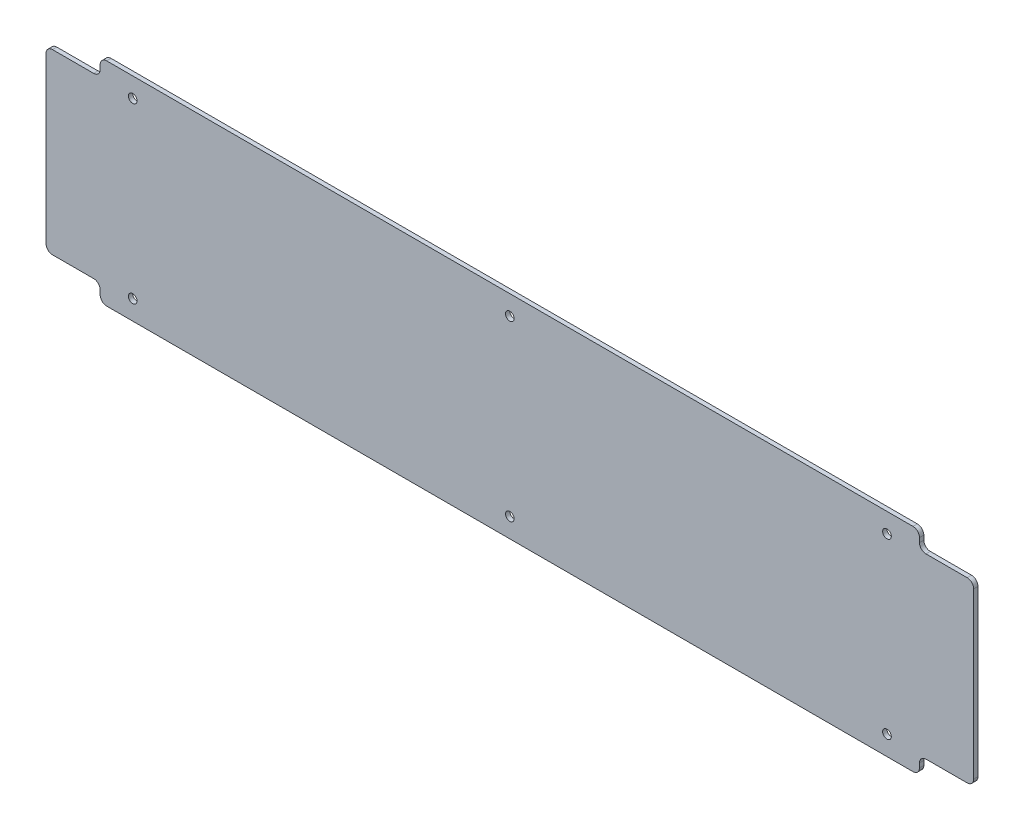
ISO-10303-21;
HEADER;
FILE_DESCRIPTION(('STEP AP214'),'2;1');
FILE_NAME('part.step','',(''),(''),'','','');
FILE_SCHEMA(('AUTOMOTIVE_DESIGN { 1 0 10303 214 1 1 1 1 }'));
ENDSEC;
DATA;
#1=APPLICATION_CONTEXT('core data for automotive mechanical design processes');
#2=APPLICATION_PROTOCOL_DEFINITION('international standard','automotive_design',2000,#1);
#3=PRODUCT_CONTEXT('',#1,'mechanical');
#4=PRODUCT('Part','Part','',(#3));
#5=PRODUCT_RELATED_PRODUCT_CATEGORY('part','',(#4));
#6=PRODUCT_DEFINITION_FORMATION('','',#4);
#7=PRODUCT_DEFINITION_CONTEXT('part definition',#1,'design');
#8=PRODUCT_DEFINITION('design','',#6,#7);
#9=PRODUCT_DEFINITION_SHAPE('','',#8);
#10=(LENGTH_UNIT() NAMED_UNIT(*) SI_UNIT(.MILLI.,.METRE.));
#11=(NAMED_UNIT(*) PLANE_ANGLE_UNIT() SI_UNIT($,.RADIAN.));
#12=(NAMED_UNIT(*) SI_UNIT($,.STERADIAN.) SOLID_ANGLE_UNIT());
#13=UNCERTAINTY_MEASURE_WITH_UNIT(LENGTH_MEASURE(1.E-05),#10,'distance_accuracy_value','');
#14=(GEOMETRIC_REPRESENTATION_CONTEXT(3) GLOBAL_UNCERTAINTY_ASSIGNED_CONTEXT((#13)) GLOBAL_UNIT_ASSIGNED_CONTEXT((#10,
#11,#12)) REPRESENTATION_CONTEXT('',''));
#15=CARTESIAN_POINT('',(0.,0.,0.));
#16=DIRECTION('',(0.,0.,1.));
#17=DIRECTION('',(1.,0.,0.));
#18=AXIS2_PLACEMENT_3D('',#15,#16,#17);
#19=CARTESIAN_POINT('',(174.,-40.,-2.));
#20=DIRECTION('',(0.,0.,1.));
#21=DIRECTION('',(1.,0.,0.));
#22=AXIS2_PLACEMENT_3D('',#19,#20,#21);
#23=CYLINDRICAL_SURFACE('',#22,2.);
#24=CARTESIAN_POINT('',(174.,-40.,-2.));
#25=DIRECTION('',(0.,0.,1.));
#26=DIRECTION('',(1.,0.,0.));
#27=AXIS2_PLACEMENT_3D('',#24,#25,#26);
#28=CIRCLE('',#27,2.);
#29=CARTESIAN_POINT('',(176.,-40.,-2.));
#30=VERTEX_POINT('',#29);
#31=EDGE_CURVE('E47',#30,#30,#28,.T.);
#32=ORIENTED_EDGE('',*,*,#31,.F.);
#33=EDGE_LOOP('',(#32));
#34=FACE_BOUND('',#33,.T.);
#35=CARTESIAN_POINT('',(174.,-40.,0.));
#36=DIRECTION('',(0.,0.,1.));
#37=DIRECTION('',(1.,0.,0.));
#38=AXIS2_PLACEMENT_3D('',#35,#36,#37);
#39=CIRCLE('',#38,2.);
#40=CARTESIAN_POINT('',(176.,-40.,0.));
#41=VERTEX_POINT('',#40);
#42=EDGE_CURVE('E11',#41,#41,#39,.T.);
#43=ORIENTED_EDGE('',*,*,#42,.T.);
#44=EDGE_LOOP('',(#43));
#45=FACE_BOUND('',#44,.T.);
#46=ADVANCED_FACE('F40',(#34,#45),#23,.F.);
#47=CARTESIAN_POINT('',(174.,40.,-2.));
#48=DIRECTION('',(0.,0.,1.));
#49=DIRECTION('',(1.,0.,0.));
#50=AXIS2_PLACEMENT_3D('',#47,#48,#49);
#51=CYLINDRICAL_SURFACE('',#50,2.);
#52=CARTESIAN_POINT('',(174.,40.,-2.));
#53=DIRECTION('',(0.,0.,1.));
#54=DIRECTION('',(1.,0.,0.));
#55=AXIS2_PLACEMENT_3D('',#52,#53,#54);
#56=CIRCLE('',#55,2.);
#57=CARTESIAN_POINT('',(176.,40.,-2.));
#58=VERTEX_POINT('',#57);
#59=EDGE_CURVE('E335',#58,#58,#56,.T.);
#60=ORIENTED_EDGE('',*,*,#59,.F.);
#61=EDGE_LOOP('',(#60));
#62=FACE_BOUND('',#61,.T.);
#63=CARTESIAN_POINT('',(174.,40.,0.));
#64=DIRECTION('',(0.,0.,1.));
#65=DIRECTION('',(1.,0.,0.));
#66=AXIS2_PLACEMENT_3D('',#63,#64,#65);
#67=CIRCLE('',#66,2.);
#68=CARTESIAN_POINT('',(176.,40.,0.));
#69=VERTEX_POINT('',#68);
#70=EDGE_CURVE('E338',#69,#69,#67,.T.);
#71=ORIENTED_EDGE('',*,*,#70,.T.);
#72=EDGE_LOOP('',(#71));
#73=FACE_BOUND('',#72,.T.);
#74=ADVANCED_FACE('F347',(#62,#73),#51,.F.);
#75=CARTESIAN_POINT('',(-214.,40.9999999999999,-2.));
#76=DIRECTION('',(0.,1.,0.));
#77=DIRECTION('',(-1.,0.,0.));
#78=AXIS2_PLACEMENT_3D('',#75,#76,#77);
#79=PLANE('',#78);
#80=DIRECTION('',(-1.,0.,0.));
#81=VECTOR('',#80,1.);
#82=CARTESIAN_POINT('',(-214.,40.9999999999999,0.));
#83=LINE('',#82,#81);
#84=CARTESIAN_POINT('',(-192.,40.9999999999999,0.));
#85=VERTEX_POINT('',#84);
#86=CARTESIAN_POINT('',(-211.,40.9999999999999,0.));
#87=VERTEX_POINT('',#86);
#88=EDGE_CURVE('E774',#85,#87,#83,.T.);
#89=ORIENTED_EDGE('',*,*,#88,.F.);
#90=DIRECTION('',(0.,0.,1.));
#91=VECTOR('',#90,1.);
#92=CARTESIAN_POINT('',(-192.,40.9999999999999,-2.));
#93=LINE('',#92,#91);
#94=CARTESIAN_POINT('',(-192.,40.9999999999999,-2.));
#95=VERTEX_POINT('',#94);
#96=EDGE_CURVE('E273',#85,#95,#93,.F.);
#97=ORIENTED_EDGE('',*,*,#96,.T.);
#98=DIRECTION('',(-1.,0.,0.));
#99=VECTOR('',#98,1.);
#100=CARTESIAN_POINT('',(-214.,40.9999999999999,-2.));
#101=LINE('',#100,#99);
#102=CARTESIAN_POINT('',(-211.,40.9999999999999,-2.));
#103=VERTEX_POINT('',#102);
#104=EDGE_CURVE('E744',#95,#103,#101,.T.);
#105=ORIENTED_EDGE('',*,*,#104,.T.);
#106=DIRECTION('',(0.,0.,1.));
#107=VECTOR('',#106,1.);
#108=CARTESIAN_POINT('',(-211.,40.9999999999999,-2.));
#109=LINE('',#108,#107);
#110=EDGE_CURVE('E270',#103,#87,#109,.T.);
#111=ORIENTED_EDGE('',*,*,#110,.T.);
#112=EDGE_LOOP('',(#89,#97,#105,#111));
#113=FACE_BOUND('',#112,.T.);
#114=ADVANCED_FACE('F372',(#113),#79,.T.);
#115=CARTESIAN_POINT('',(-189.,40.9999999999999,-2.));
#116=DIRECTION('',(-1.,0.,0.));
#117=DIRECTION('',(0.,0.,1.));
#118=AXIS2_PLACEMENT_3D('',#115,#116,#117);
#119=PLANE('',#118);
#120=DIRECTION('',(0.,-1.,0.));
#121=VECTOR('',#120,1.);
#122=CARTESIAN_POINT('',(-189.,40.9999999999999,-2.));
#123=LINE('',#122,#121);
#124=CARTESIAN_POINT('',(-189.,45.9999999999999,-2.));
#125=VERTEX_POINT('',#124);
#126=CARTESIAN_POINT('',(-189.,43.9999999999999,-2.));
#127=VERTEX_POINT('',#126);
#128=EDGE_CURVE('E230',#125,#127,#123,.T.);
#129=ORIENTED_EDGE('',*,*,#128,.T.);
#130=DIRECTION('',(0.,0.,1.));
#131=VECTOR('',#130,1.);
#132=CARTESIAN_POINT('',(-189.,43.9999999999999,0.));
#133=LINE('',#132,#131);
#134=CARTESIAN_POINT('',(-189.,43.9999999999999,0.));
#135=VERTEX_POINT('',#134);
#136=EDGE_CURVE('E267',#127,#135,#133,.T.);
#137=ORIENTED_EDGE('',*,*,#136,.T.);
#138=DIRECTION('',(0.,-1.,0.));
#139=VECTOR('',#138,1.);
#140=CARTESIAN_POINT('',(-189.,40.9999999999999,0.));
#141=LINE('',#140,#139);
#142=CARTESIAN_POINT('',(-189.,45.9999999999999,0.));
#143=VERTEX_POINT('',#142);
#144=EDGE_CURVE('E238',#143,#135,#141,.T.);
#145=ORIENTED_EDGE('',*,*,#144,.F.);
#146=DIRECTION('',(0.,0.,1.));
#147=VECTOR('',#146,1.);
#148=CARTESIAN_POINT('',(-189.,45.9999999999999,-2.));
#149=LINE('',#148,#147);
#150=EDGE_CURVE('E265',#143,#125,#149,.F.);
#151=ORIENTED_EDGE('',*,*,#150,.T.);
#152=EDGE_LOOP('',(#129,#137,#145,#151));
#153=FACE_BOUND('',#152,.T.);
#154=ADVANCED_FACE('F368',(#153),#119,.T.);
#155=CARTESIAN_POINT('',(189.,49.,-2.));
#156=DIRECTION('',(0.,1.,0.));
#157=DIRECTION('',(-1.,0.,0.));
#158=AXIS2_PLACEMENT_3D('',#155,#156,#157);
#159=PLANE('',#158);
#160=DIRECTION('',(-1.,0.,0.));
#161=VECTOR('',#160,1.);
#162=CARTESIAN_POINT('',(189.,49.,-2.));
#163=LINE('',#162,#161);
#164=CARTESIAN_POINT('',(186.,49.,-2.));
#165=VERTEX_POINT('',#164);
#166=CARTESIAN_POINT('',(-186.,48.9999999999999,-2.));
#167=VERTEX_POINT('',#166);
#168=EDGE_CURVE('E235',#165,#167,#163,.T.);
#169=ORIENTED_EDGE('',*,*,#168,.T.);
#170=DIRECTION('',(0.,0.,1.));
#171=VECTOR('',#170,1.);
#172=CARTESIAN_POINT('',(-186.,48.9999999999999,-2.));
#173=LINE('',#172,#171);
#174=CARTESIAN_POINT('',(-186.,48.9999999999999,0.));
#175=VERTEX_POINT('',#174);
#176=EDGE_CURVE('E277',#167,#175,#173,.T.);
#177=ORIENTED_EDGE('',*,*,#176,.T.);
#178=DIRECTION('',(-1.,0.,0.));
#179=VECTOR('',#178,1.);
#180=CARTESIAN_POINT('',(189.,49.,0.));
#181=LINE('',#180,#179);
#182=CARTESIAN_POINT('',(186.,49.,0.));
#183=VERTEX_POINT('',#182);
#184=EDGE_CURVE('E798',#183,#175,#181,.T.);
#185=ORIENTED_EDGE('',*,*,#184,.F.);
#186=DIRECTION('',(0.,0.,1.));
#187=VECTOR('',#186,1.);
#188=CARTESIAN_POINT('',(186.,49.,-2.));
#189=LINE('',#188,#187);
#190=EDGE_CURVE('E275',#183,#165,#189,.F.);
#191=ORIENTED_EDGE('',*,*,#190,.T.);
#192=EDGE_LOOP('',(#169,#177,#185,#191));
#193=FACE_BOUND('',#192,.T.);
#194=ADVANCED_FACE('F371',(#193),#159,.T.);
#195=CARTESIAN_POINT('',(189.,49.,-2.));
#196=DIRECTION('',(1.,0.,0.));
#197=DIRECTION('',(0.,0.,-1.));
#198=AXIS2_PLACEMENT_3D('',#195,#196,#197);
#199=PLANE('',#198);
#200=DIRECTION('',(0.,1.,0.));
#201=VECTOR('',#200,1.);
#202=CARTESIAN_POINT('',(189.,49.,0.));
#203=LINE('',#202,#201);
#204=CARTESIAN_POINT('',(189.,44.,0.));
#205=VERTEX_POINT('',#204);
#206=CARTESIAN_POINT('',(189.,46.,0.));
#207=VERTEX_POINT('',#206);
#208=EDGE_CURVE('E225',#205,#207,#203,.T.);
#209=ORIENTED_EDGE('',*,*,#208,.F.);
#210=DIRECTION('',(0.,0.,1.));
#211=VECTOR('',#210,1.);
#212=CARTESIAN_POINT('',(189.,44.,-2.));
#213=LINE('',#212,#211);
#214=CARTESIAN_POINT('',(189.,44.,-2.));
#215=VERTEX_POINT('',#214);
#216=EDGE_CURVE('E243',#205,#215,#213,.F.);
#217=ORIENTED_EDGE('',*,*,#216,.T.);
#218=DIRECTION('',(0.,1.,0.));
#219=VECTOR('',#218,1.);
#220=CARTESIAN_POINT('',(189.,49.,-2.));
#221=LINE('',#220,#219);
#222=CARTESIAN_POINT('',(189.,46.,-2.));
#223=VERTEX_POINT('',#222);
#224=EDGE_CURVE('E769',#215,#223,#221,.T.);
#225=ORIENTED_EDGE('',*,*,#224,.T.);
#226=DIRECTION('',(0.,0.,1.));
#227=VECTOR('',#226,1.);
#228=CARTESIAN_POINT('',(189.,46.,-2.));
#229=LINE('',#228,#227);
#230=EDGE_CURVE('E232',#223,#207,#229,.T.);
#231=ORIENTED_EDGE('',*,*,#230,.T.);
#232=EDGE_LOOP('',(#209,#217,#225,#231));
#233=FACE_BOUND('',#232,.T.);
#234=ADVANCED_FACE('F376',(#233),#199,.T.);
#235=CARTESIAN_POINT('',(189.,41.,-2.));
#236=DIRECTION('',(0.,1.,0.));
#237=DIRECTION('',(-1.,0.,0.));
#238=AXIS2_PLACEMENT_3D('',#235,#236,#237);
#239=PLANE('',#238);
#240=DIRECTION('',(-1.,0.,0.));
#241=VECTOR('',#240,1.);
#242=CARTESIAN_POINT('',(189.,41.,-2.));
#243=LINE('',#242,#241);
#244=CARTESIAN_POINT('',(211.,41.,-2.));
#245=VERTEX_POINT('',#244);
#246=CARTESIAN_POINT('',(192.,41.,-2.));
#247=VERTEX_POINT('',#246);
#248=EDGE_CURVE('E767',#245,#247,#243,.T.);
#249=ORIENTED_EDGE('',*,*,#248,.T.);
#250=DIRECTION('',(0.,0.,1.));
#251=VECTOR('',#250,1.);
#252=CARTESIAN_POINT('',(192.,41.,0.));
#253=LINE('',#252,#251);
#254=CARTESIAN_POINT('',(192.,41.,0.));
#255=VERTEX_POINT('',#254);
#256=EDGE_CURVE('E224',#247,#255,#253,.T.);
#257=ORIENTED_EDGE('',*,*,#256,.T.);
#258=DIRECTION('',(-1.,0.,0.));
#259=VECTOR('',#258,1.);
#260=CARTESIAN_POINT('',(189.,41.,0.));
#261=LINE('',#260,#259);
#262=CARTESIAN_POINT('',(211.,41.,0.));
#263=VERTEX_POINT('',#262);
#264=EDGE_CURVE('E207',#263,#255,#261,.T.);
#265=ORIENTED_EDGE('',*,*,#264,.F.);
#266=DIRECTION('',(0.,0.,1.));
#267=VECTOR('',#266,1.);
#268=CARTESIAN_POINT('',(211.,41.,-2.));
#269=LINE('',#268,#267);
#270=EDGE_CURVE('E221',#263,#245,#269,.F.);
#271=ORIENTED_EDGE('',*,*,#270,.T.);
#272=EDGE_LOOP('',(#249,#257,#265,#271));
#273=FACE_BOUND('',#272,.T.);
#274=ADVANCED_FACE('F220',(#273),#239,.T.);
#275=CARTESIAN_POINT('',(214.,-41.,-2.));
#276=DIRECTION('',(1.,0.,0.));
#277=DIRECTION('',(0.,0.,-1.));
#278=AXIS2_PLACEMENT_3D('',#275,#276,#277);
#279=PLANE('',#278);
#280=DIRECTION('',(0.,1.,0.));
#281=VECTOR('',#280,1.);
#282=CARTESIAN_POINT('',(214.,-41.,-2.));
#283=LINE('',#282,#281);
#284=CARTESIAN_POINT('',(214.,-38.,-2.));
#285=VERTEX_POINT('',#284);
#286=CARTESIAN_POINT('',(214.,38.,-2.));
#287=VERTEX_POINT('',#286);
#288=EDGE_CURVE('E764',#285,#287,#283,.T.);
#289=ORIENTED_EDGE('',*,*,#288,.T.);
#290=DIRECTION('',(0.,0.,1.));
#291=VECTOR('',#290,1.);
#292=CARTESIAN_POINT('',(214.,38.,-2.));
#293=LINE('',#292,#291);
#294=CARTESIAN_POINT('',(214.,38.,0.));
#295=VERTEX_POINT('',#294);
#296=EDGE_CURVE('E308',#287,#295,#293,.T.);
#297=ORIENTED_EDGE('',*,*,#296,.T.);
#298=DIRECTION('',(0.,1.,0.));
#299=VECTOR('',#298,1.);
#300=CARTESIAN_POINT('',(214.,-41.,0.));
#301=LINE('',#300,#299);
#302=CARTESIAN_POINT('',(214.,-38.,0.));
#303=VERTEX_POINT('',#302);
#304=EDGE_CURVE('E209',#303,#295,#301,.T.);
#305=ORIENTED_EDGE('',*,*,#304,.F.);
#306=DIRECTION('',(0.,0.,1.));
#307=VECTOR('',#306,1.);
#308=CARTESIAN_POINT('',(214.,-38.,-2.));
#309=LINE('',#308,#307);
#310=EDGE_CURVE('E306',#303,#285,#309,.F.);
#311=ORIENTED_EDGE('',*,*,#310,.T.);
#312=EDGE_LOOP('',(#289,#297,#305,#311));
#313=FACE_BOUND('',#312,.T.);
#314=ADVANCED_FACE('F383',(#313),#279,.T.);
#315=CARTESIAN_POINT('',(189.,-41.,-2.));
#316=DIRECTION('',(0.,-1.,0.));
#317=DIRECTION('',(1.,0.,0.));
#318=AXIS2_PLACEMENT_3D('',#315,#316,#317);
#319=PLANE('',#318);
#320=DIRECTION('',(1.,0.,0.));
#321=VECTOR('',#320,1.);
#322=CARTESIAN_POINT('',(189.,-41.,0.));
#323=LINE('',#322,#321);
#324=CARTESIAN_POINT('',(192.,-41.,0.));
#325=VERTEX_POINT('',#324);
#326=CARTESIAN_POINT('',(211.,-41.,0.));
#327=VERTEX_POINT('',#326);
#328=EDGE_CURVE('E793',#325,#327,#323,.T.);
#329=ORIENTED_EDGE('',*,*,#328,.F.);
#330=DIRECTION('',(0.,0.,1.));
#331=VECTOR('',#330,1.);
#332=CARTESIAN_POINT('',(192.,-41.,-2.));
#333=LINE('',#332,#331);
#334=CARTESIAN_POINT('',(192.,-41.,-2.));
#335=VERTEX_POINT('',#334);
#336=EDGE_CURVE('E253',#325,#335,#333,.F.);
#337=ORIENTED_EDGE('',*,*,#336,.T.);
#338=DIRECTION('',(1.,0.,0.));
#339=VECTOR('',#338,1.);
#340=CARTESIAN_POINT('',(189.,-41.,-2.));
#341=LINE('',#340,#339);
#342=CARTESIAN_POINT('',(211.,-41.,-2.));
#343=VERTEX_POINT('',#342);
#344=EDGE_CURVE('E761',#335,#343,#341,.T.);
#345=ORIENTED_EDGE('',*,*,#344,.T.);
#346=DIRECTION('',(0.,0.,1.));
#347=VECTOR('',#346,1.);
#348=CARTESIAN_POINT('',(211.,-41.,-2.));
#349=LINE('',#348,#347);
#350=EDGE_CURVE('E250',#343,#327,#349,.T.);
#351=ORIENTED_EDGE('',*,*,#350,.T.);
#352=EDGE_LOOP('',(#329,#337,#345,#351));
#353=FACE_BOUND('',#352,.T.);
#354=ADVANCED_FACE('F386',(#353),#319,.T.);
#355=CARTESIAN_POINT('',(189.,-49.,-2.));
#356=DIRECTION('',(1.,0.,0.));
#357=DIRECTION('',(0.,0.,-1.));
#358=AXIS2_PLACEMENT_3D('',#355,#356,#357);
#359=PLANE('',#358);
#360=DIRECTION('',(0.,1.,0.));
#361=VECTOR('',#360,1.);
#362=CARTESIAN_POINT('',(189.,-49.,-2.));
#363=LINE('',#362,#361);
#364=CARTESIAN_POINT('',(189.,-46.,-2.));
#365=VERTEX_POINT('',#364);
#366=CARTESIAN_POINT('',(189.,-44.,-2.));
#367=VERTEX_POINT('',#366);
#368=EDGE_CURVE('E758',#365,#367,#363,.T.);
#369=ORIENTED_EDGE('',*,*,#368,.T.);
#370=DIRECTION('',(0.,0.,1.));
#371=VECTOR('',#370,1.);
#372=CARTESIAN_POINT('',(189.,-44.,0.));
#373=LINE('',#372,#371);
#374=CARTESIAN_POINT('',(189.,-44.,0.));
#375=VERTEX_POINT('',#374);
#376=EDGE_CURVE('E247',#367,#375,#373,.T.);
#377=ORIENTED_EDGE('',*,*,#376,.T.);
#378=DIRECTION('',(0.,1.,0.));
#379=VECTOR('',#378,1.);
#380=CARTESIAN_POINT('',(189.,-49.,0.));
#381=LINE('',#380,#379);
#382=CARTESIAN_POINT('',(189.,-46.,0.));
#383=VERTEX_POINT('',#382);
#384=EDGE_CURVE('E790',#383,#375,#381,.T.);
#385=ORIENTED_EDGE('',*,*,#384,.F.);
#386=DIRECTION('',(0.,0.,1.));
#387=VECTOR('',#386,1.);
#388=CARTESIAN_POINT('',(189.,-46.,-2.));
#389=LINE('',#388,#387);
#390=EDGE_CURVE('E245',#383,#365,#389,.F.);
#391=ORIENTED_EDGE('',*,*,#390,.T.);
#392=EDGE_LOOP('',(#369,#377,#385,#391));
#393=FACE_BOUND('',#392,.T.);
#394=ADVANCED_FACE('F390',(#393),#359,.T.);
#395=CARTESIAN_POINT('',(189.,-49.,-2.));
#396=DIRECTION('',(0.,-1.,0.));
#397=DIRECTION('',(1.,0.,0.));
#398=AXIS2_PLACEMENT_3D('',#395,#396,#397);
#399=PLANE('',#398);
#400=DIRECTION('',(1.,0.,0.));
#401=VECTOR('',#400,1.);
#402=CARTESIAN_POINT('',(189.,-49.,-2.));
#403=LINE('',#402,#401);
#404=CARTESIAN_POINT('',(-186.,-48.9999999999999,-2.));
#405=VERTEX_POINT('',#404);
#406=CARTESIAN_POINT('',(186.,-49.,-2.));
#407=VERTEX_POINT('',#406);
#408=EDGE_CURVE('E755',#405,#407,#403,.T.);
#409=ORIENTED_EDGE('',*,*,#408,.T.);
#410=DIRECTION('',(0.,0.,1.));
#411=VECTOR('',#410,1.);
#412=CARTESIAN_POINT('',(186.,-49.,-2.));
#413=LINE('',#412,#411);
#414=CARTESIAN_POINT('',(186.,-49.,0.));
#415=VERTEX_POINT('',#414);
#416=EDGE_CURVE('E312',#407,#415,#413,.T.);
#417=ORIENTED_EDGE('',*,*,#416,.T.);
#418=DIRECTION('',(1.,0.,0.));
#419=VECTOR('',#418,1.);
#420=CARTESIAN_POINT('',(189.,-49.,0.));
#421=LINE('',#420,#419);
#422=CARTESIAN_POINT('',(-186.,-48.9999999999999,0.));
#423=VERTEX_POINT('',#422);
#424=EDGE_CURVE('E787',#423,#415,#421,.T.);
#425=ORIENTED_EDGE('',*,*,#424,.F.);
#426=DIRECTION('',(0.,0.,1.));
#427=VECTOR('',#426,1.);
#428=CARTESIAN_POINT('',(-186.,-48.9999999999999,-2.));
#429=LINE('',#428,#427);
#430=EDGE_CURVE('E310',#423,#405,#429,.F.);
#431=ORIENTED_EDGE('',*,*,#430,.T.);
#432=EDGE_LOOP('',(#409,#417,#425,#431));
#433=FACE_BOUND('',#432,.T.);
#434=ADVANCED_FACE('F394',(#433),#399,.T.);
#435=CARTESIAN_POINT('',(-189.,-41.,-2.));
#436=DIRECTION('',(-1.,0.,0.));
#437=DIRECTION('',(0.,0.,1.));
#438=AXIS2_PLACEMENT_3D('',#435,#436,#437);
#439=PLANE('',#438);
#440=DIRECTION('',(0.,-1.,0.));
#441=VECTOR('',#440,1.);
#442=CARTESIAN_POINT('',(-189.,-41.,0.));
#443=LINE('',#442,#441);
#444=CARTESIAN_POINT('',(-189.,-44.,0.));
#445=VERTEX_POINT('',#444);
#446=CARTESIAN_POINT('',(-189.,-45.9999999999999,0.));
#447=VERTEX_POINT('',#446);
#448=EDGE_CURVE('E784',#445,#447,#443,.T.);
#449=ORIENTED_EDGE('',*,*,#448,.F.);
#450=DIRECTION('',(0.,0.,1.));
#451=VECTOR('',#450,1.);
#452=CARTESIAN_POINT('',(-189.,-44.,-2.));
#453=LINE('',#452,#451);
#454=CARTESIAN_POINT('',(-189.,-44.,-2.));
#455=VERTEX_POINT('',#454);
#456=EDGE_CURVE('E263',#445,#455,#453,.F.);
#457=ORIENTED_EDGE('',*,*,#456,.T.);
#458=DIRECTION('',(0.,-1.,0.));
#459=VECTOR('',#458,1.);
#460=CARTESIAN_POINT('',(-189.,-41.,-2.));
#461=LINE('',#460,#459);
#462=CARTESIAN_POINT('',(-189.,-45.9999999999999,-2.));
#463=VERTEX_POINT('',#462);
#464=EDGE_CURVE('E752',#455,#463,#461,.T.);
#465=ORIENTED_EDGE('',*,*,#464,.T.);
#466=DIRECTION('',(0.,0.,1.));
#467=VECTOR('',#466,1.);
#468=CARTESIAN_POINT('',(-189.,-45.9999999999999,-2.));
#469=LINE('',#468,#467);
#470=EDGE_CURVE('E260',#463,#447,#469,.T.);
#471=ORIENTED_EDGE('',*,*,#470,.T.);
#472=EDGE_LOOP('',(#449,#457,#465,#471));
#473=FACE_BOUND('',#472,.T.);
#474=ADVANCED_FACE('F398',(#473),#439,.T.);
#475=CARTESIAN_POINT('',(-214.,-41.,-2.));
#476=DIRECTION('',(0.,-1.,0.));
#477=DIRECTION('',(0.,0.,-1.));
#478=AXIS2_PLACEMENT_3D('',#475,#476,#477);
#479=PLANE('',#478);
#480=DIRECTION('',(1.,0.,0.));
#481=VECTOR('',#480,1.);
#482=CARTESIAN_POINT('',(-214.,-41.,-2.));
#483=LINE('',#482,#481);
#484=CARTESIAN_POINT('',(-211.,-41.,-2.));
#485=VERTEX_POINT('',#484);
#486=CARTESIAN_POINT('',(-192.,-41.,-2.));
#487=VERTEX_POINT('',#486);
#488=EDGE_CURVE('E749',#485,#487,#483,.T.);
#489=ORIENTED_EDGE('',*,*,#488,.T.);
#490=DIRECTION('',(0.,0.,1.));
#491=VECTOR('',#490,1.);
#492=CARTESIAN_POINT('',(-192.,-41.,0.));
#493=LINE('',#492,#491);
#494=CARTESIAN_POINT('',(-192.,-41.,0.));
#495=VERTEX_POINT('',#494);
#496=EDGE_CURVE('E257',#487,#495,#493,.T.);
#497=ORIENTED_EDGE('',*,*,#496,.T.);
#498=DIRECTION('',(1.,0.,0.));
#499=VECTOR('',#498,1.);
#500=CARTESIAN_POINT('',(-214.,-41.,0.));
#501=LINE('',#500,#499);
#502=CARTESIAN_POINT('',(-211.,-41.,0.));
#503=VERTEX_POINT('',#502);
#504=EDGE_CURVE('E781',#503,#495,#501,.T.);
#505=ORIENTED_EDGE('',*,*,#504,.F.);
#506=DIRECTION('',(0.,0.,1.));
#507=VECTOR('',#506,1.);
#508=CARTESIAN_POINT('',(-211.,-41.,-2.));
#509=LINE('',#508,#507);
#510=EDGE_CURVE('E255',#503,#485,#509,.F.);
#511=ORIENTED_EDGE('',*,*,#510,.T.);
#512=EDGE_LOOP('',(#489,#497,#505,#511));
#513=FACE_BOUND('',#512,.T.);
#514=ADVANCED_FACE('F402',(#513),#479,.T.);
#515=CARTESIAN_POINT('',(-214.,-41.,-2.));
#516=DIRECTION('',(-1.,0.,0.));
#517=DIRECTION('',(0.,0.,1.));
#518=AXIS2_PLACEMENT_3D('',#515,#516,#517);
#519=PLANE('',#518);
#520=DIRECTION('',(0.,-1.,0.));
#521=VECTOR('',#520,1.);
#522=CARTESIAN_POINT('',(-214.,-41.,-2.));
#523=LINE('',#522,#521);
#524=CARTESIAN_POINT('',(-214.,37.9999999999999,-2.));
#525=VERTEX_POINT('',#524);
#526=CARTESIAN_POINT('',(-214.,-38.,-2.));
#527=VERTEX_POINT('',#526);
#528=EDGE_CURVE('E747',#525,#527,#523,.T.);
#529=ORIENTED_EDGE('',*,*,#528,.T.);
#530=DIRECTION('',(0.,0.,1.));
#531=VECTOR('',#530,1.);
#532=CARTESIAN_POINT('',(-214.,-38.,-2.));
#533=LINE('',#532,#531);
#534=CARTESIAN_POINT('',(-214.,-38.,0.));
#535=VERTEX_POINT('',#534);
#536=EDGE_CURVE('E316',#527,#535,#533,.T.);
#537=ORIENTED_EDGE('',*,*,#536,.T.);
#538=DIRECTION('',(0.,-1.,0.));
#539=VECTOR('',#538,1.);
#540=CARTESIAN_POINT('',(-214.,-41.,0.));
#541=LINE('',#540,#539);
#542=CARTESIAN_POINT('',(-214.,37.9999999999999,0.));
#543=VERTEX_POINT('',#542);
#544=EDGE_CURVE('E777',#543,#535,#541,.T.);
#545=ORIENTED_EDGE('',*,*,#544,.F.);
#546=DIRECTION('',(0.,0.,1.));
#547=VECTOR('',#546,1.);
#548=CARTESIAN_POINT('',(-214.,37.9999999999999,-2.));
#549=LINE('',#548,#547);
#550=EDGE_CURVE('E61',#543,#525,#549,.F.);
#551=ORIENTED_EDGE('',*,*,#550,.T.);
#552=EDGE_LOOP('',(#529,#537,#545,#551));
#553=FACE_BOUND('',#552,.T.);
#554=ADVANCED_FACE('F361',(#553),#519,.T.);
#555=CARTESIAN_POINT('',(0.,0.,-2.));
#556=DIRECTION('',(0.,0.,1.));
#557=DIRECTION('',(1.,0.,0.));
#558=AXIS2_PLACEMENT_3D('',#555,#556,#557);
#559=PLANE('',#558);
#560=CARTESIAN_POINT('',(0.,-40.,-2.));
#561=DIRECTION('',(0.,0.,1.));
#562=DIRECTION('',(1.,0.,0.));
#563=AXIS2_PLACEMENT_3D('',#560,#561,#562);
#564=CIRCLE('',#563,2.);
#565=CARTESIAN_POINT('',(1.99999999999997,-40.,-2.));
#566=VERTEX_POINT('',#565);
#567=EDGE_CURVE('E859',#566,#566,#564,.T.);
#568=ORIENTED_EDGE('',*,*,#567,.T.);
#569=EDGE_LOOP('',(#568));
#570=FACE_BOUND('',#569,.T.);
#571=CARTESIAN_POINT('',(0.,40.,-2.));
#572=DIRECTION('',(0.,0.,1.));
#573=DIRECTION('',(1.,0.,0.));
#574=AXIS2_PLACEMENT_3D('',#571,#572,#573);
#575=CIRCLE('',#574,2.);
#576=CARTESIAN_POINT('',(1.99999999999997,40.,-2.));
#577=VERTEX_POINT('',#576);
#578=EDGE_CURVE('E740',#577,#577,#575,.T.);
#579=ORIENTED_EDGE('',*,*,#578,.T.);
#580=EDGE_LOOP('',(#579));
#581=FACE_BOUND('',#580,.T.);
#582=CARTESIAN_POINT('',(-174.,40.,-2.));
#583=DIRECTION('',(0.,0.,1.));
#584=DIRECTION('',(1.,0.,0.));
#585=AXIS2_PLACEMENT_3D('',#582,#583,#584);
#586=CIRCLE('',#585,2.);
#587=CARTESIAN_POINT('',(-172.,40.,-2.));
#588=VERTEX_POINT('',#587);
#589=EDGE_CURVE('E778',#588,#588,#586,.T.);
#590=ORIENTED_EDGE('',*,*,#589,.T.);
#591=EDGE_LOOP('',(#590));
#592=FACE_BOUND('',#591,.T.);
#593=CARTESIAN_POINT('',(-174.,-40.,-2.));
#594=DIRECTION('',(0.,0.,1.));
#595=DIRECTION('',(1.,0.,0.));
#596=AXIS2_PLACEMENT_3D('',#593,#594,#595);
#597=CIRCLE('',#596,2.);
#598=CARTESIAN_POINT('',(-172.,-40.,-2.));
#599=VERTEX_POINT('',#598);
#600=EDGE_CURVE('E730',#599,#599,#597,.T.);
#601=ORIENTED_EDGE('',*,*,#600,.T.);
#602=EDGE_LOOP('',(#601));
#603=FACE_BOUND('',#602,.T.);
#604=ORIENTED_EDGE('',*,*,#128,.F.);
#605=CARTESIAN_POINT('',(-186.,45.9999999999999,-2.));
#606=DIRECTION('',(0.,0.,1.));
#607=DIRECTION('',(1.,0.,0.));
#608=AXIS2_PLACEMENT_3D('',#605,#606,#607);
#609=CIRCLE('',#608,3.);
#610=EDGE_CURVE('E304',#125,#167,#609,.F.);
#611=ORIENTED_EDGE('',*,*,#610,.T.);
#612=ORIENTED_EDGE('',*,*,#168,.F.);
#613=CARTESIAN_POINT('',(186.,46.,-2.));
#614=DIRECTION('',(0.,0.,1.));
#615=DIRECTION('',(1.,0.,0.));
#616=AXIS2_PLACEMENT_3D('',#613,#614,#615);
#617=CIRCLE('',#616,3.);
#618=EDGE_CURVE('E302',#165,#223,#617,.F.);
#619=ORIENTED_EDGE('',*,*,#618,.T.);
#620=ORIENTED_EDGE('',*,*,#224,.F.);
#621=CARTESIAN_POINT('',(192.,44.,-2.));
#622=DIRECTION('',(0.,0.,1.));
#623=DIRECTION('',(1.,0.,0.));
#624=AXIS2_PLACEMENT_3D('',#621,#622,#623);
#625=CIRCLE('',#624,3.);
#626=EDGE_CURVE('E321',#215,#247,#625,.T.);
#627=ORIENTED_EDGE('',*,*,#626,.T.);
#628=ORIENTED_EDGE('',*,*,#248,.F.);
#629=CARTESIAN_POINT('',(211.,38.,-2.));
#630=DIRECTION('',(0.,0.,1.));
#631=DIRECTION('',(1.,0.,0.));
#632=AXIS2_PLACEMENT_3D('',#629,#630,#631);
#633=CIRCLE('',#632,3.);
#634=EDGE_CURVE('E229',#245,#287,#633,.F.);
#635=ORIENTED_EDGE('',*,*,#634,.T.);
#636=ORIENTED_EDGE('',*,*,#288,.F.);
#637=CARTESIAN_POINT('',(211.,-38.,-2.));
#638=DIRECTION('',(0.,0.,1.));
#639=DIRECTION('',(1.,0.,0.));
#640=AXIS2_PLACEMENT_3D('',#637,#638,#639);
#641=CIRCLE('',#640,3.);
#642=EDGE_CURVE('E299',#285,#343,#641,.F.);
#643=ORIENTED_EDGE('',*,*,#642,.T.);
#644=ORIENTED_EDGE('',*,*,#344,.F.);
#645=CARTESIAN_POINT('',(192.,-44.,-2.));
#646=DIRECTION('',(0.,0.,1.));
#647=DIRECTION('',(1.,0.,0.));
#648=AXIS2_PLACEMENT_3D('',#645,#646,#647);
#649=CIRCLE('',#648,3.);
#650=EDGE_CURVE('E325',#335,#367,#649,.T.);
#651=ORIENTED_EDGE('',*,*,#650,.T.);
#652=ORIENTED_EDGE('',*,*,#368,.F.);
#653=CARTESIAN_POINT('',(186.,-46.,-2.));
#654=DIRECTION('',(0.,0.,1.));
#655=DIRECTION('',(1.,0.,0.));
#656=AXIS2_PLACEMENT_3D('',#653,#654,#655);
#657=CIRCLE('',#656,3.);
#658=EDGE_CURVE('E297',#365,#407,#657,.F.);
#659=ORIENTED_EDGE('',*,*,#658,.T.);
#660=ORIENTED_EDGE('',*,*,#408,.F.);
#661=CARTESIAN_POINT('',(-186.,-45.9999999999999,-2.));
#662=DIRECTION('',(0.,0.,1.));
#663=DIRECTION('',(1.,0.,0.));
#664=AXIS2_PLACEMENT_3D('',#661,#662,#663);
#665=CIRCLE('',#664,3.);
#666=EDGE_CURVE('E295',#405,#463,#665,.F.);
#667=ORIENTED_EDGE('',*,*,#666,.T.);
#668=ORIENTED_EDGE('',*,*,#464,.F.);
#669=CARTESIAN_POINT('',(-192.,-44.,-2.));
#670=DIRECTION('',(0.,0.,1.));
#671=DIRECTION('',(1.,0.,0.));
#672=AXIS2_PLACEMENT_3D('',#669,#670,#671);
#673=CIRCLE('',#672,3.);
#674=EDGE_CURVE('E329',#455,#487,#673,.T.);
#675=ORIENTED_EDGE('',*,*,#674,.T.);
#676=ORIENTED_EDGE('',*,*,#488,.F.);
#677=CARTESIAN_POINT('',(-211.,-38.,-2.));
#678=DIRECTION('',(0.,0.,1.));
#679=DIRECTION('',(1.,0.,0.));
#680=AXIS2_PLACEMENT_3D('',#677,#678,#679);
#681=CIRCLE('',#680,3.);
#682=EDGE_CURVE('E54',#485,#527,#681,.F.);
#683=ORIENTED_EDGE('',*,*,#682,.T.);
#684=ORIENTED_EDGE('',*,*,#528,.F.);
#685=CARTESIAN_POINT('',(-211.,37.9999999999999,-2.));
#686=DIRECTION('',(0.,0.,1.));
#687=DIRECTION('',(1.,0.,0.));
#688=AXIS2_PLACEMENT_3D('',#685,#686,#687);
#689=CIRCLE('',#688,3.);
#690=EDGE_CURVE('E292',#525,#103,#689,.F.);
#691=ORIENTED_EDGE('',*,*,#690,.T.);
#692=ORIENTED_EDGE('',*,*,#104,.F.);
#693=CARTESIAN_POINT('',(-192.,43.9999999999999,-2.));
#694=DIRECTION('',(0.,0.,1.));
#695=DIRECTION('',(1.,0.,0.));
#696=AXIS2_PLACEMENT_3D('',#693,#694,#695);
#697=CIRCLE('',#696,3.);
#698=EDGE_CURVE('E333',#95,#127,#697,.T.);
#699=ORIENTED_EDGE('',*,*,#698,.T.);
#700=EDGE_LOOP('',(#604,#611,#612,#619,#620,#627,#628,#635,#636,#643,#644,#651,#652,#659,#660,
#667,#668,#675,#676,#683,#684,#691,#692,#699));
#701=FACE_BOUND('',#700,.T.);
#702=ORIENTED_EDGE('',*,*,#59,.T.);
#703=EDGE_LOOP('',(#702));
#704=FACE_BOUND('',#703,.T.);
#705=ORIENTED_EDGE('',*,*,#31,.T.);
#706=EDGE_LOOP('',(#705));
#707=FACE_BOUND('',#706,.T.);
#708=ADVANCED_FACE('F343',(#570,#581,#592,#603,#701,#704,#707),#559,.F.);
#709=CARTESIAN_POINT('',(0.,0.,0.));
#710=DIRECTION('',(0.,0.,1.));
#711=DIRECTION('',(1.,0.,0.));
#712=AXIS2_PLACEMENT_3D('',#709,#710,#711);
#713=PLANE('',#712);
#714=CARTESIAN_POINT('',(0.,-40.,0.));
#715=DIRECTION('',(0.,0.,1.));
#716=DIRECTION('',(1.,0.,0.));
#717=AXIS2_PLACEMENT_3D('',#714,#715,#716);
#718=CIRCLE('',#717,2.);
#719=CARTESIAN_POINT('',(1.99999999999997,-40.,0.));
#720=VERTEX_POINT('',#719);
#721=EDGE_CURVE('E856',#720,#720,#718,.T.);
#722=ORIENTED_EDGE('',*,*,#721,.F.);
#723=EDGE_LOOP('',(#722));
#724=FACE_BOUND('',#723,.T.);
#725=CARTESIAN_POINT('',(0.,40.,0.));
#726=DIRECTION('',(0.,0.,1.));
#727=DIRECTION('',(1.,0.,0.));
#728=AXIS2_PLACEMENT_3D('',#725,#726,#727);
#729=CIRCLE('',#728,2.);
#730=CARTESIAN_POINT('',(1.99999999999997,40.,0.));
#731=VERTEX_POINT('',#730);
#732=EDGE_CURVE('E735',#731,#731,#729,.T.);
#733=ORIENTED_EDGE('',*,*,#732,.F.);
#734=EDGE_LOOP('',(#733));
#735=FACE_BOUND('',#734,.T.);
#736=CARTESIAN_POINT('',(-174.,40.,0.));
#737=DIRECTION('',(0.,0.,1.));
#738=DIRECTION('',(1.,0.,0.));
#739=AXIS2_PLACEMENT_3D('',#736,#737,#738);
#740=CIRCLE('',#739,2.);
#741=CARTESIAN_POINT('',(-172.,40.,0.));
#742=VERTEX_POINT('',#741);
#743=EDGE_CURVE('E737',#742,#742,#740,.T.);
#744=ORIENTED_EDGE('',*,*,#743,.F.);
#745=EDGE_LOOP('',(#744));
#746=FACE_BOUND('',#745,.T.);
#747=CARTESIAN_POINT('',(-174.,-40.,0.));
#748=DIRECTION('',(0.,0.,1.));
#749=DIRECTION('',(1.,0.,0.));
#750=AXIS2_PLACEMENT_3D('',#747,#748,#749);
#751=CIRCLE('',#750,2.);
#752=CARTESIAN_POINT('',(-172.,-40.,0.));
#753=VERTEX_POINT('',#752);
#754=EDGE_CURVE('E733',#753,#753,#751,.T.);
#755=ORIENTED_EDGE('',*,*,#754,.F.);
#756=EDGE_LOOP('',(#755));
#757=FACE_BOUND('',#756,.T.);
#758=ORIENTED_EDGE('',*,*,#184,.T.);
#759=CARTESIAN_POINT('',(-186.,45.9999999999999,0.));
#760=DIRECTION('',(0.,0.,1.));
#761=DIRECTION('',(1.,0.,0.));
#762=AXIS2_PLACEMENT_3D('',#759,#760,#761);
#763=CIRCLE('',#762,3.);
#764=EDGE_CURVE('E290',#175,#143,#763,.T.);
#765=ORIENTED_EDGE('',*,*,#764,.T.);
#766=ORIENTED_EDGE('',*,*,#144,.T.);
#767=CARTESIAN_POINT('',(-192.,43.9999999999999,0.));
#768=DIRECTION('',(0.,0.,1.));
#769=DIRECTION('',(1.,0.,0.));
#770=AXIS2_PLACEMENT_3D('',#767,#768,#769);
#771=CIRCLE('',#770,3.);
#772=EDGE_CURVE('E331',#135,#85,#771,.F.);
#773=ORIENTED_EDGE('',*,*,#772,.T.);
#774=ORIENTED_EDGE('',*,*,#88,.T.);
#775=CARTESIAN_POINT('',(-211.,37.9999999999999,0.));
#776=DIRECTION('',(0.,0.,1.));
#777=DIRECTION('',(1.,0.,0.));
#778=AXIS2_PLACEMENT_3D('',#775,#776,#777);
#779=CIRCLE('',#778,3.);
#780=EDGE_CURVE('E280',#87,#543,#779,.T.);
#781=ORIENTED_EDGE('',*,*,#780,.T.);
#782=ORIENTED_EDGE('',*,*,#544,.T.);
#783=CARTESIAN_POINT('',(-211.,-38.,0.));
#784=DIRECTION('',(0.,0.,1.));
#785=DIRECTION('',(1.,0.,0.));
#786=AXIS2_PLACEMENT_3D('',#783,#784,#785);
#787=CIRCLE('',#786,3.);
#788=EDGE_CURVE('E282',#535,#503,#787,.T.);
#789=ORIENTED_EDGE('',*,*,#788,.T.);
#790=ORIENTED_EDGE('',*,*,#504,.T.);
#791=CARTESIAN_POINT('',(-192.,-44.,0.));
#792=DIRECTION('',(0.,0.,1.));
#793=DIRECTION('',(1.,0.,0.));
#794=AXIS2_PLACEMENT_3D('',#791,#792,#793);
#795=CIRCLE('',#794,3.);
#796=EDGE_CURVE('E327',#495,#445,#795,.F.);
#797=ORIENTED_EDGE('',*,*,#796,.T.);
#798=ORIENTED_EDGE('',*,*,#448,.T.);
#799=CARTESIAN_POINT('',(-186.,-45.9999999999999,0.));
#800=DIRECTION('',(0.,0.,1.));
#801=DIRECTION('',(1.,0.,0.));
#802=AXIS2_PLACEMENT_3D('',#799,#800,#801);
#803=CIRCLE('',#802,3.);
#804=EDGE_CURVE('E284',#447,#423,#803,.T.);
#805=ORIENTED_EDGE('',*,*,#804,.T.);
#806=ORIENTED_EDGE('',*,*,#424,.T.);
#807=CARTESIAN_POINT('',(186.,-46.,0.));
#808=DIRECTION('',(0.,0.,1.));
#809=DIRECTION('',(1.,0.,0.));
#810=AXIS2_PLACEMENT_3D('',#807,#808,#809);
#811=CIRCLE('',#810,3.);
#812=EDGE_CURVE('E286',#415,#383,#811,.T.);
#813=ORIENTED_EDGE('',*,*,#812,.T.);
#814=ORIENTED_EDGE('',*,*,#384,.T.);
#815=CARTESIAN_POINT('',(192.,-44.,0.));
#816=DIRECTION('',(0.,0.,1.));
#817=DIRECTION('',(1.,0.,0.));
#818=AXIS2_PLACEMENT_3D('',#815,#816,#817);
#819=CIRCLE('',#818,3.);
#820=EDGE_CURVE('E323',#375,#325,#819,.F.);
#821=ORIENTED_EDGE('',*,*,#820,.T.);
#822=ORIENTED_EDGE('',*,*,#328,.T.);
#823=CARTESIAN_POINT('',(211.,-38.,0.));
#824=DIRECTION('',(0.,0.,1.));
#825=DIRECTION('',(1.,0.,0.));
#826=AXIS2_PLACEMENT_3D('',#823,#824,#825);
#827=CIRCLE('',#826,3.);
#828=EDGE_CURVE('E215',#327,#303,#827,.T.);
#829=ORIENTED_EDGE('',*,*,#828,.T.);
#830=ORIENTED_EDGE('',*,*,#304,.T.);
#831=CARTESIAN_POINT('',(211.,38.,0.));
#832=DIRECTION('',(0.,0.,1.));
#833=DIRECTION('',(1.,0.,0.));
#834=AXIS2_PLACEMENT_3D('',#831,#832,#833);
#835=CIRCLE('',#834,3.);
#836=EDGE_CURVE('E202',#295,#263,#835,.T.);
#837=ORIENTED_EDGE('',*,*,#836,.T.);
#838=ORIENTED_EDGE('',*,*,#264,.T.);
#839=CARTESIAN_POINT('',(192.,44.,0.));
#840=DIRECTION('',(0.,0.,1.));
#841=DIRECTION('',(1.,0.,0.));
#842=AXIS2_PLACEMENT_3D('',#839,#840,#841);
#843=CIRCLE('',#842,3.);
#844=EDGE_CURVE('E319',#255,#205,#843,.F.);
#845=ORIENTED_EDGE('',*,*,#844,.T.);
#846=ORIENTED_EDGE('',*,*,#208,.T.);
#847=CARTESIAN_POINT('',(186.,46.,0.));
#848=DIRECTION('',(0.,0.,1.));
#849=DIRECTION('',(1.,0.,0.));
#850=AXIS2_PLACEMENT_3D('',#847,#848,#849);
#851=CIRCLE('',#850,3.);
#852=EDGE_CURVE('E214',#207,#183,#851,.T.);
#853=ORIENTED_EDGE('',*,*,#852,.T.);
#854=EDGE_LOOP('',(#758,#765,#766,#773,#774,#781,#782,#789,#790,#797,#798,#805,#806,#813,#814,
#821,#822,#829,#830,#837,#838,#845,#846,#853));
#855=FACE_BOUND('',#854,.T.);
#856=ORIENTED_EDGE('',*,*,#70,.F.);
#857=EDGE_LOOP('',(#856));
#858=FACE_BOUND('',#857,.T.);
#859=ORIENTED_EDGE('',*,*,#42,.F.);
#860=EDGE_LOOP('',(#859));
#861=FACE_BOUND('',#860,.T.);
#862=ADVANCED_FACE('F205',(#724,#735,#746,#757,#855,#858,#861),#713,.T.);
#863=CARTESIAN_POINT('',(192.,44.,-2.));
#864=DIRECTION('',(0.,0.,-1.));
#865=DIRECTION('',(-1.,0.,0.));
#866=AXIS2_PLACEMENT_3D('',#863,#864,#865);
#867=CYLINDRICAL_SURFACE('',#866,3.);
#868=ORIENTED_EDGE('',*,*,#626,.F.);
#869=ORIENTED_EDGE('',*,*,#216,.F.);
#870=ORIENTED_EDGE('',*,*,#844,.F.);
#871=ORIENTED_EDGE('',*,*,#256,.F.);
#872=EDGE_LOOP('',(#868,#869,#870,#871));
#873=FACE_BOUND('',#872,.T.);
#874=ADVANCED_FACE('F351',(#873),#867,.F.);
#875=CARTESIAN_POINT('',(192.,-44.,-2.));
#876=DIRECTION('',(0.,0.,-1.));
#877=DIRECTION('',(-1.,0.,0.));
#878=AXIS2_PLACEMENT_3D('',#875,#876,#877);
#879=CYLINDRICAL_SURFACE('',#878,3.);
#880=ORIENTED_EDGE('',*,*,#650,.F.);
#881=ORIENTED_EDGE('',*,*,#336,.F.);
#882=ORIENTED_EDGE('',*,*,#820,.F.);
#883=ORIENTED_EDGE('',*,*,#376,.F.);
#884=EDGE_LOOP('',(#880,#881,#882,#883));
#885=FACE_BOUND('',#884,.T.);
#886=ADVANCED_FACE('F358',(#885),#879,.F.);
#887=CARTESIAN_POINT('',(-192.,-44.,-2.));
#888=DIRECTION('',(0.,0.,-1.));
#889=DIRECTION('',(-1.,0.,0.));
#890=AXIS2_PLACEMENT_3D('',#887,#888,#889);
#891=CYLINDRICAL_SURFACE('',#890,3.);
#892=ORIENTED_EDGE('',*,*,#674,.F.);
#893=ORIENTED_EDGE('',*,*,#456,.F.);
#894=ORIENTED_EDGE('',*,*,#796,.F.);
#895=ORIENTED_EDGE('',*,*,#496,.F.);
#896=EDGE_LOOP('',(#892,#893,#894,#895));
#897=FACE_BOUND('',#896,.T.);
#898=ADVANCED_FACE('F414',(#897),#891,.F.);
#899=CARTESIAN_POINT('',(-192.,43.9999999999999,-2.));
#900=DIRECTION('',(0.,0.,-1.));
#901=DIRECTION('',(-1.,0.,0.));
#902=AXIS2_PLACEMENT_3D('',#899,#900,#901);
#903=CYLINDRICAL_SURFACE('',#902,3.);
#904=ORIENTED_EDGE('',*,*,#698,.F.);
#905=ORIENTED_EDGE('',*,*,#96,.F.);
#906=ORIENTED_EDGE('',*,*,#772,.F.);
#907=ORIENTED_EDGE('',*,*,#136,.F.);
#908=EDGE_LOOP('',(#904,#905,#906,#907));
#909=FACE_BOUND('',#908,.T.);
#910=ADVANCED_FACE('F418',(#909),#903,.F.);
#911=CARTESIAN_POINT('',(-186.,45.9999999999999,-2.));
#912=DIRECTION('',(0.,0.,1.));
#913=DIRECTION('',(1.,0.,0.));
#914=AXIS2_PLACEMENT_3D('',#911,#912,#913);
#915=CYLINDRICAL_SURFACE('',#914,3.);
#916=ORIENTED_EDGE('',*,*,#610,.F.);
#917=ORIENTED_EDGE('',*,*,#150,.F.);
#918=ORIENTED_EDGE('',*,*,#764,.F.);
#919=ORIENTED_EDGE('',*,*,#176,.F.);
#920=EDGE_LOOP('',(#916,#917,#918,#919));
#921=FACE_BOUND('',#920,.T.);
#922=ADVANCED_FACE('F422',(#921),#915,.T.);
#923=CARTESIAN_POINT('',(186.,46.,-2.));
#924=DIRECTION('',(0.,0.,1.));
#925=DIRECTION('',(1.,0.,0.));
#926=AXIS2_PLACEMENT_3D('',#923,#924,#925);
#927=CYLINDRICAL_SURFACE('',#926,3.);
#928=ORIENTED_EDGE('',*,*,#618,.F.);
#929=ORIENTED_EDGE('',*,*,#190,.F.);
#930=ORIENTED_EDGE('',*,*,#852,.F.);
#931=ORIENTED_EDGE('',*,*,#230,.F.);
#932=EDGE_LOOP('',(#928,#929,#930,#931));
#933=FACE_BOUND('',#932,.T.);
#934=ADVANCED_FACE('F426',(#933),#927,.T.);
#935=CARTESIAN_POINT('',(211.,38.,-2.));
#936=DIRECTION('',(0.,0.,1.));
#937=DIRECTION('',(1.,0.,0.));
#938=AXIS2_PLACEMENT_3D('',#935,#936,#937);
#939=CYLINDRICAL_SURFACE('',#938,3.);
#940=ORIENTED_EDGE('',*,*,#634,.F.);
#941=ORIENTED_EDGE('',*,*,#270,.F.);
#942=ORIENTED_EDGE('',*,*,#836,.F.);
#943=ORIENTED_EDGE('',*,*,#296,.F.);
#944=EDGE_LOOP('',(#940,#941,#942,#943));
#945=FACE_BOUND('',#944,.T.);
#946=ADVANCED_FACE('F228',(#945),#939,.T.);
#947=CARTESIAN_POINT('',(211.,-38.,-2.));
#948=DIRECTION('',(0.,0.,1.));
#949=DIRECTION('',(1.,0.,0.));
#950=AXIS2_PLACEMENT_3D('',#947,#948,#949);
#951=CYLINDRICAL_SURFACE('',#950,3.);
#952=ORIENTED_EDGE('',*,*,#642,.F.);
#953=ORIENTED_EDGE('',*,*,#310,.F.);
#954=ORIENTED_EDGE('',*,*,#828,.F.);
#955=ORIENTED_EDGE('',*,*,#350,.F.);
#956=EDGE_LOOP('',(#952,#953,#954,#955));
#957=FACE_BOUND('',#956,.T.);
#958=ADVANCED_FACE('F433',(#957),#951,.T.);
#959=CARTESIAN_POINT('',(186.,-46.,-2.));
#960=DIRECTION('',(0.,0.,1.));
#961=DIRECTION('',(1.,0.,0.));
#962=AXIS2_PLACEMENT_3D('',#959,#960,#961);
#963=CYLINDRICAL_SURFACE('',#962,3.);
#964=ORIENTED_EDGE('',*,*,#658,.F.);
#965=ORIENTED_EDGE('',*,*,#390,.F.);
#966=ORIENTED_EDGE('',*,*,#812,.F.);
#967=ORIENTED_EDGE('',*,*,#416,.F.);
#968=EDGE_LOOP('',(#964,#965,#966,#967));
#969=FACE_BOUND('',#968,.T.);
#970=ADVANCED_FACE('F436',(#969),#963,.T.);
#971=CARTESIAN_POINT('',(-186.,-45.9999999999999,-2.));
#972=DIRECTION('',(0.,0.,1.));
#973=DIRECTION('',(1.,0.,0.));
#974=AXIS2_PLACEMENT_3D('',#971,#972,#973);
#975=CYLINDRICAL_SURFACE('',#974,3.);
#976=ORIENTED_EDGE('',*,*,#666,.F.);
#977=ORIENTED_EDGE('',*,*,#430,.F.);
#978=ORIENTED_EDGE('',*,*,#804,.F.);
#979=ORIENTED_EDGE('',*,*,#470,.F.);
#980=EDGE_LOOP('',(#976,#977,#978,#979));
#981=FACE_BOUND('',#980,.T.);
#982=ADVANCED_FACE('F440',(#981),#975,.T.);
#983=CARTESIAN_POINT('',(-211.,-38.,-2.));
#984=DIRECTION('',(0.,0.,1.));
#985=DIRECTION('',(1.,0.,0.));
#986=AXIS2_PLACEMENT_3D('',#983,#984,#985);
#987=CYLINDRICAL_SURFACE('',#986,3.);
#988=ORIENTED_EDGE('',*,*,#682,.F.);
#989=ORIENTED_EDGE('',*,*,#510,.F.);
#990=ORIENTED_EDGE('',*,*,#788,.F.);
#991=ORIENTED_EDGE('',*,*,#536,.F.);
#992=EDGE_LOOP('',(#988,#989,#990,#991));
#993=FACE_BOUND('',#992,.T.);
#994=ADVANCED_FACE('F444',(#993),#987,.T.);
#995=CARTESIAN_POINT('',(-211.,37.9999999999999,-2.));
#996=DIRECTION('',(0.,0.,1.));
#997=DIRECTION('',(1.,0.,0.));
#998=AXIS2_PLACEMENT_3D('',#995,#996,#997);
#999=CYLINDRICAL_SURFACE('',#998,3.);
#1000=ORIENTED_EDGE('',*,*,#690,.F.);
#1001=ORIENTED_EDGE('',*,*,#550,.F.);
#1002=ORIENTED_EDGE('',*,*,#780,.F.);
#1003=ORIENTED_EDGE('',*,*,#110,.F.);
#1004=EDGE_LOOP('',(#1000,#1001,#1002,#1003));
#1005=FACE_BOUND('',#1004,.T.);
#1006=ADVANCED_FACE('F448',(#1005),#999,.T.);
#1007=CARTESIAN_POINT('',(-174.,-40.,-2.));
#1008=DIRECTION('',(0.,0.,1.));
#1009=DIRECTION('',(1.,0.,0.));
#1010=AXIS2_PLACEMENT_3D('',#1007,#1008,#1009);
#1011=CYLINDRICAL_SURFACE('',#1010,2.);
#1012=ORIENTED_EDGE('',*,*,#600,.F.);
#1013=EDGE_LOOP('',(#1012));
#1014=FACE_BOUND('',#1013,.T.);
#1015=ORIENTED_EDGE('',*,*,#754,.T.);
#1016=EDGE_LOOP('',(#1015));
#1017=FACE_BOUND('',#1016,.T.);
#1018=ADVANCED_FACE('F451',(#1014,#1017),#1011,.F.);
#1019=CARTESIAN_POINT('',(-174.,40.,-2.));
#1020=DIRECTION('',(0.,0.,1.));
#1021=DIRECTION('',(1.,0.,0.));
#1022=AXIS2_PLACEMENT_3D('',#1019,#1020,#1021);
#1023=CYLINDRICAL_SURFACE('',#1022,2.);
#1024=ORIENTED_EDGE('',*,*,#589,.F.);
#1025=EDGE_LOOP('',(#1024));
#1026=FACE_BOUND('',#1025,.T.);
#1027=ORIENTED_EDGE('',*,*,#743,.T.);
#1028=EDGE_LOOP('',(#1027));
#1029=FACE_BOUND('',#1028,.T.);
#1030=ADVANCED_FACE('F531',(#1026,#1029),#1023,.F.);
#1031=CARTESIAN_POINT('',(0.,40.,-2.));
#1032=DIRECTION('',(0.,0.,1.));
#1033=DIRECTION('',(1.,0.,0.));
#1034=AXIS2_PLACEMENT_3D('',#1031,#1032,#1033);
#1035=CYLINDRICAL_SURFACE('',#1034,2.);
#1036=ORIENTED_EDGE('',*,*,#578,.F.);
#1037=EDGE_LOOP('',(#1036));
#1038=FACE_BOUND('',#1037,.T.);
#1039=ORIENTED_EDGE('',*,*,#732,.T.);
#1040=EDGE_LOOP('',(#1039));
#1041=FACE_BOUND('',#1040,.T.);
#1042=ADVANCED_FACE('F525',(#1038,#1041),#1035,.F.);
#1043=CARTESIAN_POINT('',(0.,-40.,-2.));
#1044=DIRECTION('',(0.,0.,1.));
#1045=DIRECTION('',(1.,0.,0.));
#1046=AXIS2_PLACEMENT_3D('',#1043,#1044,#1045);
#1047=CYLINDRICAL_SURFACE('',#1046,2.);
#1048=ORIENTED_EDGE('',*,*,#567,.F.);
#1049=EDGE_LOOP('',(#1048));
#1050=FACE_BOUND('',#1049,.T.);
#1051=ORIENTED_EDGE('',*,*,#721,.T.);
#1052=EDGE_LOOP('',(#1051));
#1053=FACE_BOUND('',#1052,.T.);
#1054=ADVANCED_FACE('F530',(#1050,#1053),#1047,.F.);
#1055=CLOSED_SHELL('',(#46,#74,#114,#154,#194,#234,#274,#314,#354,#394,#434,#474,#514,#554,#708,
#862,#874,#886,#898,#910,#922,#934,#946,#958,#970,#982,#994,#1006,#1018,#1030,#1042,#1054));
#1056=MANIFOLD_SOLID_BREP('B2',#1055);
#1057=ADVANCED_BREP_SHAPE_REPRESENTATION('',(#18,#1056),#14);
#1058=SHAPE_DEFINITION_REPRESENTATION(#9,#1057);
ENDSEC;
END-ISO-10303-21;
